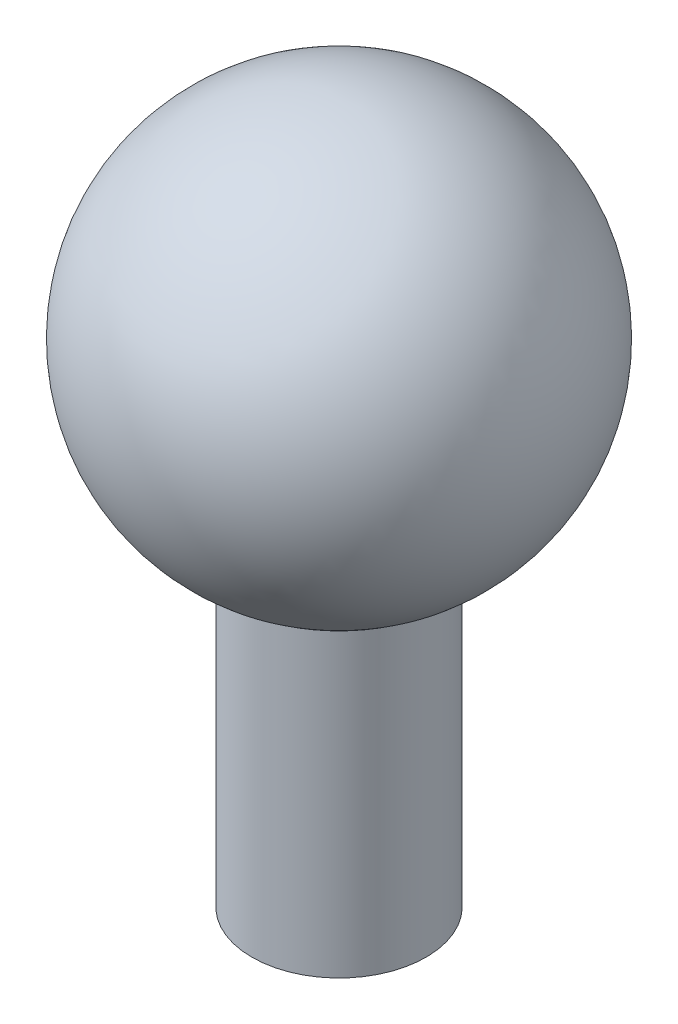
ISO-10303-21;
HEADER;
FILE_DESCRIPTION(('STEP AP214'),'2;1');
FILE_NAME('part.step','',(''),(''),'','','');
FILE_SCHEMA(('AUTOMOTIVE_DESIGN { 1 0 10303 214 1 1 1 1 }'));
ENDSEC;
DATA;
#1=APPLICATION_CONTEXT('core data for automotive mechanical design processes');
#2=APPLICATION_PROTOCOL_DEFINITION('international standard','automotive_design',2000,#1);
#3=PRODUCT_CONTEXT('',#1,'mechanical');
#4=PRODUCT('Part','Part','',(#3));
#5=PRODUCT_RELATED_PRODUCT_CATEGORY('part','',(#4));
#6=PRODUCT_DEFINITION_FORMATION('','',#4);
#7=PRODUCT_DEFINITION_CONTEXT('part definition',#1,'design');
#8=PRODUCT_DEFINITION('design','',#6,#7);
#9=PRODUCT_DEFINITION_SHAPE('','',#8);
#10=(LENGTH_UNIT() NAMED_UNIT(*) SI_UNIT(.MILLI.,.METRE.));
#11=(NAMED_UNIT(*) PLANE_ANGLE_UNIT() SI_UNIT($,.RADIAN.));
#12=(NAMED_UNIT(*) SI_UNIT($,.STERADIAN.) SOLID_ANGLE_UNIT());
#13=UNCERTAINTY_MEASURE_WITH_UNIT(LENGTH_MEASURE(1.E-05),#10,'distance_accuracy_value','');
#14=(GEOMETRIC_REPRESENTATION_CONTEXT(3) GLOBAL_UNCERTAINTY_ASSIGNED_CONTEXT((#13)) GLOBAL_UNIT_ASSIGNED_CONTEXT((#10,
#11,#12)) REPRESENTATION_CONTEXT('',''));
#15=CARTESIAN_POINT('',(0.,0.,0.));
#16=DIRECTION('',(0.,0.,1.));
#17=DIRECTION('',(1.,0.,0.));
#18=AXIS2_PLACEMENT_3D('',#15,#16,#17);
#19=CARTESIAN_POINT('',(0.,3.5,0.));
#20=DIRECTION('',(0.,-1.,0.));
#21=DIRECTION('',(0.,0.,-1.));
#22=AXIS2_PLACEMENT_3D('',#19,#20,#21);
#23=CYLINDRICAL_SURFACE('',#22,1.);
#24=CARTESIAN_POINT('',(0.,0.,0.));
#25=DIRECTION('',(0.,1.,0.));
#26=DIRECTION('',(0.,0.,1.));
#27=AXIS2_PLACEMENT_3D('',#24,#25,#26);
#28=CIRCLE('',#27,1.);
#29=CARTESIAN_POINT('',(0.,0.,1.));
#30=VERTEX_POINT('',#29);
#31=EDGE_CURVE('E40',#30,#30,#28,.T.);
#32=ORIENTED_EDGE('',*,*,#31,.T.);
#33=EDGE_LOOP('',(#32));
#34=FACE_BOUND('',#33,.T.);
#35=CARTESIAN_POINT('',(0.,3.49739345400431,0.));
#36=DIRECTION('',(0.,1.,0.));
#37=DIRECTION('',(0.,0.,1.));
#38=AXIS2_PLACEMENT_3D('',#35,#36,#37);
#39=CIRCLE('',#38,1.);
#40=CARTESIAN_POINT('',(0.,3.49739345400431,1.));
#41=VERTEX_POINT('',#40);
#42=EDGE_CURVE('E10',#41,#41,#39,.T.);
#43=ORIENTED_EDGE('',*,*,#42,.F.);
#44=EDGE_LOOP('',(#43));
#45=FACE_BOUND('',#44,.T.);
#46=ADVANCED_FACE('F34',(#34,#45),#23,.T.);
#47=CARTESIAN_POINT('',(0.,0.,0.));
#48=DIRECTION('',(0.,1.,0.));
#49=DIRECTION('',(0.,0.,1.));
#50=AXIS2_PLACEMENT_3D('',#47,#48,#49);
#51=PLANE('',#50);
#52=ORIENTED_EDGE('',*,*,#31,.F.);
#53=EDGE_LOOP('',(#52));
#54=FACE_BOUND('',#53,.T.);
#55=ADVANCED_FACE('F48',(#54),#51,.F.);
#56=CARTESIAN_POINT('',(0.,5.65160444645607,0.));
#57=DIRECTION('',(0.,-1.,0.));
#58=DIRECTION('',(-1.,0.,0.));
#59=AXIS2_PLACEMENT_3D('',#56,#57,#58);
#60=SPHERICAL_SURFACE('',#59,2.375);
#61=ORIENTED_EDGE('',*,*,#42,.T.);
#62=EDGE_LOOP('',(#61));
#63=FACE_BOUND('',#62,.T.);
#64=ADVANCED_FACE('F50',(#63),#60,.T.);
#65=CLOSED_SHELL('',(#46,#55,#64));
#66=MANIFOLD_SOLID_BREP('B2',#65);
#67=ADVANCED_BREP_SHAPE_REPRESENTATION('',(#18,#66),#14);
#68=SHAPE_DEFINITION_REPRESENTATION(#9,#67);
ENDSEC;
END-ISO-10303-21;
